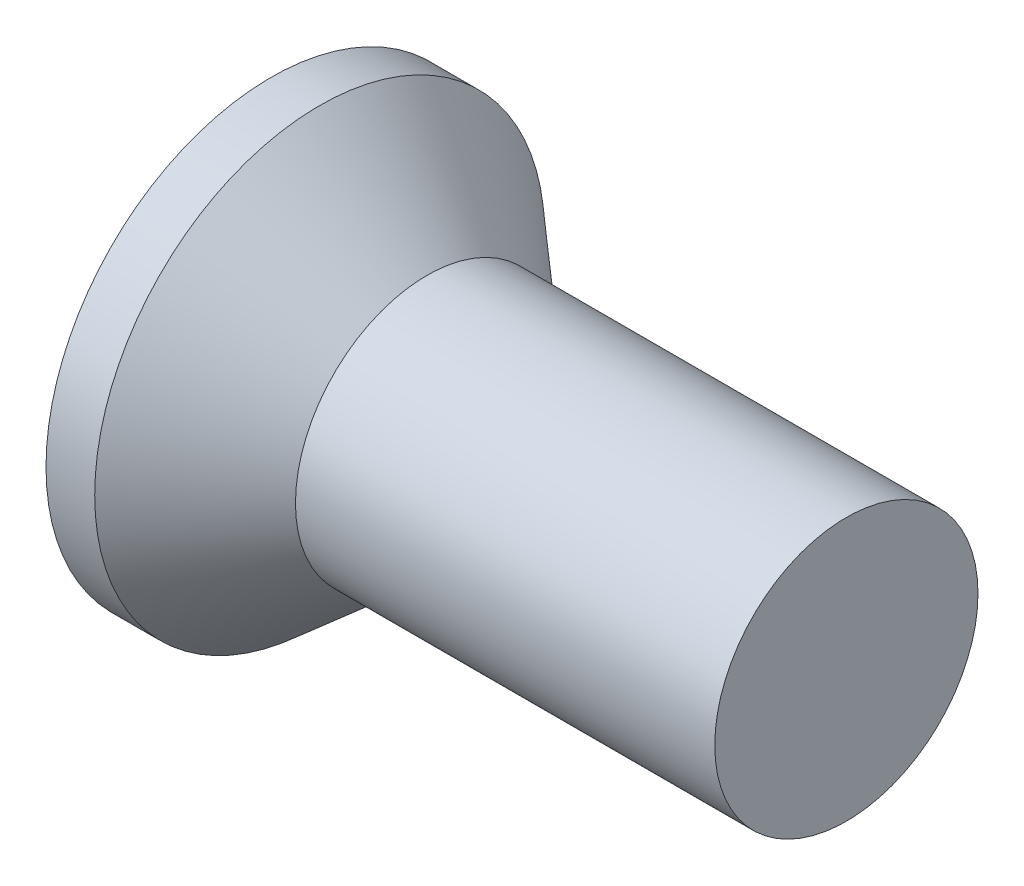
ISO-10303-21;
HEADER;
FILE_DESCRIPTION(('STEP AP214'),'2;1');
FILE_NAME('part.step','',(''),(''),'','','');
FILE_SCHEMA(('AUTOMOTIVE_DESIGN { 1 0 10303 214 1 1 1 1 }'));
ENDSEC;
DATA;
#1=APPLICATION_CONTEXT('core data for automotive mechanical design processes');
#2=APPLICATION_PROTOCOL_DEFINITION('international standard','automotive_design',2000,#1);
#3=PRODUCT_CONTEXT('',#1,'mechanical');
#4=PRODUCT('Part','Part','',(#3));
#5=PRODUCT_RELATED_PRODUCT_CATEGORY('part','',(#4));
#6=PRODUCT_DEFINITION_FORMATION('','',#4);
#7=PRODUCT_DEFINITION_CONTEXT('part definition',#1,'design');
#8=PRODUCT_DEFINITION('design','',#6,#7);
#9=PRODUCT_DEFINITION_SHAPE('','',#8);
#10=(LENGTH_UNIT() NAMED_UNIT(*) SI_UNIT(.MILLI.,.METRE.));
#11=(NAMED_UNIT(*) PLANE_ANGLE_UNIT() SI_UNIT($,.RADIAN.));
#12=(NAMED_UNIT(*) SI_UNIT($,.STERADIAN.) SOLID_ANGLE_UNIT());
#13=UNCERTAINTY_MEASURE_WITH_UNIT(LENGTH_MEASURE(1.E-05),#10,'distance_accuracy_value','');
#14=(GEOMETRIC_REPRESENTATION_CONTEXT(3) GLOBAL_UNCERTAINTY_ASSIGNED_CONTEXT((#13)) GLOBAL_UNIT_ASSIGNED_CONTEXT((#10,
#11,#12)) REPRESENTATION_CONTEXT('',''));
#15=CARTESIAN_POINT('',(0.,0.,0.));
#16=DIRECTION('',(0.,0.,1.));
#17=DIRECTION('',(1.,0.,0.));
#18=AXIS2_PLACEMENT_3D('',#15,#16,#17);
#19=CARTESIAN_POINT('',(0.,0.,0.));
#20=DIRECTION('',(-1.,0.,0.));
#21=DIRECTION('',(0.,0.,1.));
#22=AXIS2_PLACEMENT_3D('',#19,#20,#21);
#23=PLANE('',#22);
#24=CARTESIAN_POINT('',(0.,0.,0.));
#25=DIRECTION('',(-1.,0.,0.));
#26=DIRECTION('',(0.,0.,1.));
#27=AXIS2_PLACEMENT_3D('',#24,#25,#26);
#28=CIRCLE('',#27,1.8669);
#29=CARTESIAN_POINT('',(0.,0.,1.8669));
#30=VERTEX_POINT('',#29);
#31=EDGE_CURVE('E156',#30,#30,#28,.T.);
#32=ORIENTED_EDGE('',*,*,#31,.T.);
#33=EDGE_LOOP('',(#32));
#34=FACE_BOUND('',#33,.T.);
#35=DIRECTION('',(0.,1.,0.));
#36=VECTOR('',#35,1.);
#37=CARTESIAN_POINT('',(0.,-1.524,-0.342899999999999));
#38=LINE('',#37,#36);
#39=CARTESIAN_POINT('',(0.,-1.524,-0.342899999999999));
#40=VERTEX_POINT('',#39);
#41=CARTESIAN_POINT('',(0.,-0.342899999999999,-0.342899999999999));
#42=VERTEX_POINT('',#41);
#43=EDGE_CURVE('E140',#40,#42,#38,.T.);
#44=ORIENTED_EDGE('',*,*,#43,.T.);
#45=DIRECTION('',(0.,0.,-1.));
#46=VECTOR('',#45,1.);
#47=CARTESIAN_POINT('',(0.,-0.342900000000005,1.524));
#48=LINE('',#47,#46);
#49=CARTESIAN_POINT('',(0.,-0.342899999999995,-1.524));
#50=VERTEX_POINT('',#49);
#51=EDGE_CURVE('E108',#42,#50,#48,.T.);
#52=ORIENTED_EDGE('',*,*,#51,.T.);
#53=DIRECTION('',(0.,1.,0.));
#54=VECTOR('',#53,1.);
#55=CARTESIAN_POINT('',(0.,-0.342899999999995,-1.524));
#56=LINE('',#55,#54);
#57=CARTESIAN_POINT('',(0.,0.342900000000004,-1.524));
#58=VERTEX_POINT('',#57);
#59=EDGE_CURVE('E118',#50,#58,#56,.T.);
#60=ORIENTED_EDGE('',*,*,#59,.T.);
#61=DIRECTION('',(0.,0.,1.));
#62=VECTOR('',#61,1.);
#63=CARTESIAN_POINT('',(0.,0.342900000000004,-1.524));
#64=LINE('',#63,#62);
#65=CARTESIAN_POINT('',(0.,0.3429,-0.342899999999999));
#66=VERTEX_POINT('',#65);
#67=EDGE_CURVE('E352',#58,#66,#64,.T.);
#68=ORIENTED_EDGE('',*,*,#67,.T.);
#69=CARTESIAN_POINT('',(0.,1.524,-0.342899999999999));
#70=VERTEX_POINT('',#69);
#71=EDGE_CURVE('E143',#66,#70,#38,.T.);
#72=ORIENTED_EDGE('',*,*,#71,.T.);
#73=DIRECTION('',(0.,0.,1.));
#74=VECTOR('',#73,1.);
#75=CARTESIAN_POINT('',(0.,1.524,-0.342899999999999));
#76=LINE('',#75,#74);
#77=CARTESIAN_POINT('',(0.,1.524,0.3429));
#78=VERTEX_POINT('',#77);
#79=EDGE_CURVE('E147',#70,#78,#76,.T.);
#80=ORIENTED_EDGE('',*,*,#79,.T.);
#81=DIRECTION('',(0.,-1.,0.));
#82=VECTOR('',#81,1.);
#83=CARTESIAN_POINT('',(0.,1.524,0.3429));
#84=LINE('',#83,#82);
#85=CARTESIAN_POINT('',(0.,0.342899999999998,0.3429));
#86=VERTEX_POINT('',#85);
#87=EDGE_CURVE('E151',#78,#86,#84,.T.);
#88=ORIENTED_EDGE('',*,*,#87,.T.);
#89=CARTESIAN_POINT('',(0.,0.342899999999994,1.524));
#90=VERTEX_POINT('',#89);
#91=EDGE_CURVE('E119',#86,#90,#64,.T.);
#92=ORIENTED_EDGE('',*,*,#91,.T.);
#93=DIRECTION('',(0.,-1.,0.));
#94=VECTOR('',#93,1.);
#95=CARTESIAN_POINT('',(0.,0.342899999999994,1.524));
#96=LINE('',#95,#94);
#97=CARTESIAN_POINT('',(0.,-0.342900000000005,1.524));
#98=VERTEX_POINT('',#97);
#99=EDGE_CURVE('E355',#90,#98,#96,.T.);
#100=ORIENTED_EDGE('',*,*,#99,.T.);
#101=CARTESIAN_POINT('',(0.,-0.342900000000001,0.3429));
#102=VERTEX_POINT('',#101);
#103=EDGE_CURVE('E357',#98,#102,#48,.T.);
#104=ORIENTED_EDGE('',*,*,#103,.T.);
#105=CARTESIAN_POINT('',(0.,-1.524,0.3429));
#106=VERTEX_POINT('',#105);
#107=EDGE_CURVE('E150',#102,#106,#84,.T.);
#108=ORIENTED_EDGE('',*,*,#107,.T.);
#109=DIRECTION('',(0.,0.,-1.));
#110=VECTOR('',#109,1.);
#111=CARTESIAN_POINT('',(0.,-1.524,0.3429));
#112=LINE('',#111,#110);
#113=EDGE_CURVE('E154',#106,#40,#112,.T.);
#114=ORIENTED_EDGE('',*,*,#113,.T.);
#115=EDGE_LOOP('',(#44,#52,#60,#68,#72,#80,#88,#92,#100,#104,#108,#114));
#116=FACE_BOUND('',#115,.T.);
#117=ADVANCED_FACE('F36',(#34,#116),#23,.T.);
#118=CARTESIAN_POINT('',(1.8889014084507,0.,0.149716901408451));
#119=DIRECTION('',(-0.10174201540996,0.,-0.99481081734183));
#120=DIRECTION('',(-0.99481081734183,0.,0.10174201540996));
#121=AXIS2_PLACEMENT_3D('',#118,#119,#120);
#122=PLANE('',#121);
#123=ORIENTED_EDGE('',*,*,#107,.F.);
#124=DIRECTION('',(0.989701588102974,0.101219480601441,-0.10121948060144));
#125=VECTOR('',#124,1.);
#126=CARTESIAN_POINT('',(1.90389961056498,-0.148182994374036,0.148182994374036));
#127=LINE('',#126,#125);
#128=CARTESIAN_POINT('',(1.6764,-0.171450000000001,0.17145));
#129=VERTEX_POINT('',#128);
#130=EDGE_CURVE('E137',#102,#129,#127,.T.);
#131=ORIENTED_EDGE('',*,*,#130,.T.);
#132=DIRECTION('',(0.775819870407917,0.625945577260933,-0.0793452140189915));
#133=VECTOR('',#132,1.);
#134=CARTESIAN_POINT('',(0.,-1.524,0.3429));
#135=LINE('',#134,#133);
#136=EDGE_CURVE('E127',#106,#129,#135,.T.);
#137=ORIENTED_EDGE('',*,*,#136,.F.);
#138=EDGE_LOOP('',(#123,#131,#137));
#139=FACE_BOUND('',#138,.T.);
#140=ADVANCED_FACE('F181',(#139),#122,.T.);
#141=DIRECTION('',(0.775819870407917,-0.625945577260933,-0.0793452140189913));
#142=VECTOR('',#141,1.);
#143=CARTESIAN_POINT('',(0.,1.524,0.3429));
#144=LINE('',#143,#142);
#145=CARTESIAN_POINT('',(1.6764,0.17145,0.17145));
#146=VERTEX_POINT('',#145);
#147=EDGE_CURVE('E51',#78,#146,#144,.T.);
#148=ORIENTED_EDGE('',*,*,#147,.T.);
#149=DIRECTION('',(-0.989701588102974,0.10121948060144,0.10121948060144));
#150=VECTOR('',#149,1.);
#151=CARTESIAN_POINT('',(1.90389961056498,0.148182994374035,0.148182994374036));
#152=LINE('',#151,#150);
#153=EDGE_CURVE('E339',#146,#86,#152,.T.);
#154=ORIENTED_EDGE('',*,*,#153,.T.);
#155=ORIENTED_EDGE('',*,*,#87,.F.);
#156=EDGE_LOOP('',(#148,#154,#155));
#157=FACE_BOUND('',#156,.T.);
#158=ADVANCED_FACE('F187',(#157),#122,.T.);
#159=CARTESIAN_POINT('',(1.8889014084507,0.,-0.149716901408451));
#160=DIRECTION('',(-0.101742015409959,0.,0.99481081734183));
#161=DIRECTION('',(0.99481081734183,0.,0.101742015409959));
#162=AXIS2_PLACEMENT_3D('',#159,#160,#161);
#163=PLANE('',#162);
#164=DIRECTION('',(0.775819870407917,0.625945577260933,0.0793452140189911));
#165=VECTOR('',#164,1.);
#166=CARTESIAN_POINT('',(0.,-1.524,-0.342899999999999));
#167=LINE('',#166,#165);
#168=CARTESIAN_POINT('',(1.6764,-0.17145,-0.171450000000001));
#169=VERTEX_POINT('',#168);
#170=EDGE_CURVE('E59',#40,#169,#167,.T.);
#171=ORIENTED_EDGE('',*,*,#170,.T.);
#172=DIRECTION('',(-0.989701588102974,-0.10121948060144,-0.10121948060144));
#173=VECTOR('',#172,1.);
#174=CARTESIAN_POINT('',(1.90389961056498,-0.148182994374035,-0.148182994374036));
#175=LINE('',#174,#173);
#176=EDGE_CURVE('E11',#169,#42,#175,.T.);
#177=ORIENTED_EDGE('',*,*,#176,.T.);
#178=ORIENTED_EDGE('',*,*,#43,.F.);
#179=EDGE_LOOP('',(#171,#177,#178));
#180=FACE_BOUND('',#179,.T.);
#181=ADVANCED_FACE('F139',(#180),#163,.T.);
#182=ORIENTED_EDGE('',*,*,#71,.F.);
#183=DIRECTION('',(0.989701588102974,-0.10121948060144,0.10121948060144));
#184=VECTOR('',#183,1.);
#185=CARTESIAN_POINT('',(1.90389961056498,0.148182994374036,-0.148182994374036));
#186=LINE('',#185,#184);
#187=CARTESIAN_POINT('',(1.6764,0.17145,-0.17145));
#188=VERTEX_POINT('',#187);
#189=EDGE_CURVE('E350',#66,#188,#186,.T.);
#190=ORIENTED_EDGE('',*,*,#189,.T.);
#191=DIRECTION('',(0.775819870407917,-0.625945577260933,0.0793452140189911));
#192=VECTOR('',#191,1.);
#193=CARTESIAN_POINT('',(0.,1.524,-0.342899999999999));
#194=LINE('',#193,#192);
#195=EDGE_CURVE('E130',#70,#188,#194,.T.);
#196=ORIENTED_EDGE('',*,*,#195,.F.);
#197=EDGE_LOOP('',(#182,#190,#196));
#198=FACE_BOUND('',#197,.T.);
#199=ADVANCED_FACE('F172',(#198),#163,.T.);
#200=CARTESIAN_POINT('',(4.7752,1.0922,0.));
#201=DIRECTION('',(1.,0.,0.));
#202=DIRECTION('',(0.,0.,-1.));
#203=AXIS2_PLACEMENT_3D('',#200,#201,#202);
#204=PLANE('',#203);
#205=CARTESIAN_POINT('',(4.7752,0.,0.));
#206=DIRECTION('',(-1.,0.,0.));
#207=DIRECTION('',(0.,0.,1.));
#208=AXIS2_PLACEMENT_3D('',#205,#206,#207);
#209=CIRCLE('',#208,1.0922);
#210=CARTESIAN_POINT('',(4.7752,0.,1.0922));
#211=VERTEX_POINT('',#210);
#212=EDGE_CURVE('E44',#211,#211,#209,.T.);
#213=ORIENTED_EDGE('',*,*,#212,.F.);
#214=EDGE_LOOP('',(#213));
#215=FACE_BOUND('',#214,.T.);
#216=ADVANCED_FACE('F38',(#215),#204,.T.);
#217=CARTESIAN_POINT('',(-6.34999999999999,0.,0.));
#218=DIRECTION('',(-1.,0.,0.));
#219=DIRECTION('',(0.,0.,1.));
#220=AXIS2_PLACEMENT_3D('',#217,#218,#219);
#221=CYLINDRICAL_SURFACE('',#220,1.0922);
#222=ORIENTED_EDGE('',*,*,#212,.T.);
#223=EDGE_LOOP('',(#222));
#224=FACE_BOUND('',#223,.T.);
#225=CARTESIAN_POINT('',(1.2954,0.,0.));
#226=DIRECTION('',(-1.,0.,0.));
#227=DIRECTION('',(0.,0.,1.));
#228=AXIS2_PLACEMENT_3D('',#225,#226,#227);
#229=CIRCLE('',#228,1.0922);
#230=CARTESIAN_POINT('',(1.2954,0.,1.0922));
#231=VERTEX_POINT('',#230);
#232=EDGE_CURVE('E163',#231,#231,#229,.T.);
#233=ORIENTED_EDGE('',*,*,#232,.F.);
#234=EDGE_LOOP('',(#233));
#235=FACE_BOUND('',#234,.T.);
#236=ADVANCED_FACE('F168',(#224,#235),#221,.T.);
#237=CARTESIAN_POINT('',(0.404209594925888,0.,0.));
#238=DIRECTION('',(-1.,0.,0.));
#239=DIRECTION('',(0.,0.,1.));
#240=AXIS2_PLACEMENT_3D('',#237,#238,#239);
#241=CONICAL_SURFACE('',#240,1.8669,0.715584993317677);
#242=ORIENTED_EDGE('',*,*,#232,.T.);
#243=EDGE_LOOP('',(#242));
#244=FACE_BOUND('',#243,.T.);
#245=CARTESIAN_POINT('',(0.404209594925888,0.,0.));
#246=DIRECTION('',(-1.,0.,0.));
#247=DIRECTION('',(0.,0.,1.));
#248=AXIS2_PLACEMENT_3D('',#245,#246,#247);
#249=CIRCLE('',#248,1.8669);
#250=CARTESIAN_POINT('',(0.404209594925888,0.,1.8669));
#251=VERTEX_POINT('',#250);
#252=EDGE_CURVE('E160',#251,#251,#249,.T.);
#253=ORIENTED_EDGE('',*,*,#252,.F.);
#254=EDGE_LOOP('',(#253));
#255=FACE_BOUND('',#254,.T.);
#256=ADVANCED_FACE('F177',(#244,#255),#241,.T.);
#257=CARTESIAN_POINT('',(-6.34999999999999,0.,0.));
#258=DIRECTION('',(-1.,0.,0.));
#259=DIRECTION('',(0.,0.,1.));
#260=AXIS2_PLACEMENT_3D('',#257,#258,#259);
#261=CYLINDRICAL_SURFACE('',#260,1.8669);
#262=ORIENTED_EDGE('',*,*,#252,.T.);
#263=EDGE_LOOP('',(#262));
#264=FACE_BOUND('',#263,.T.);
#265=ORIENTED_EDGE('',*,*,#31,.F.);
#266=EDGE_LOOP('',(#265));
#267=FACE_BOUND('',#266,.T.);
#268=ADVANCED_FACE('F193',(#264,#267),#261,.T.);
#269=CARTESIAN_POINT('',(1.6764,0.17145,-0.17145));
#270=DIRECTION('',(1.,0.,0.));
#271=DIRECTION('',(0.,0.,-1.));
#272=AXIS2_PLACEMENT_3D('',#269,#270,#271);
#273=PLANE('',#272);
#274=DIRECTION('',(0.,1.,0.));
#275=VECTOR('',#274,1.);
#276=CARTESIAN_POINT('',(1.6764,-0.17145,-0.17145));
#277=LINE('',#276,#275);
#278=EDGE_CURVE('E115',#169,#188,#277,.T.);
#279=ORIENTED_EDGE('',*,*,#278,.F.);
#280=DIRECTION('',(0.,0.,-1.));
#281=VECTOR('',#280,1.);
#282=CARTESIAN_POINT('',(1.6764,-0.17145,0.17145));
#283=LINE('',#282,#281);
#284=EDGE_CURVE('E124',#129,#169,#283,.T.);
#285=ORIENTED_EDGE('',*,*,#284,.F.);
#286=DIRECTION('',(0.,-1.,0.));
#287=VECTOR('',#286,1.);
#288=CARTESIAN_POINT('',(1.6764,0.17145,0.17145));
#289=LINE('',#288,#287);
#290=EDGE_CURVE('E131',#146,#129,#289,.T.);
#291=ORIENTED_EDGE('',*,*,#290,.F.);
#292=DIRECTION('',(0.,0.,1.));
#293=VECTOR('',#292,1.);
#294=CARTESIAN_POINT('',(1.6764,0.17145,-0.17145));
#295=LINE('',#294,#293);
#296=EDGE_CURVE('E135',#188,#146,#295,.T.);
#297=ORIENTED_EDGE('',*,*,#296,.F.);
#298=EDGE_LOOP('',(#279,#285,#291,#297));
#299=FACE_BOUND('',#298,.T.);
#300=ADVANCED_FACE('F134',(#299),#273,.F.);
#301=CARTESIAN_POINT('',(0.,-1.524,-0.342899999999999));
#302=DIRECTION('',(-0.627925301137923,0.778273612677989,0.));
#303=DIRECTION('',(-0.778273612677989,-0.627925301137923,0.));
#304=AXIS2_PLACEMENT_3D('',#301,#302,#303);
#305=PLANE('',#304);
#306=ORIENTED_EDGE('',*,*,#170,.F.);
#307=ORIENTED_EDGE('',*,*,#113,.F.);
#308=ORIENTED_EDGE('',*,*,#136,.T.);
#309=ORIENTED_EDGE('',*,*,#284,.T.);
#310=EDGE_LOOP('',(#306,#307,#308,#309));
#311=FACE_BOUND('',#310,.T.);
#312=ADVANCED_FACE('F125',(#311),#305,.T.);
#313=CARTESIAN_POINT('',(1.6764,0.17145,0.17145));
#314=DIRECTION('',(-0.627925301137923,-0.778273612677989,0.));
#315=DIRECTION('',(0.778273612677989,-0.627925301137923,0.));
#316=AXIS2_PLACEMENT_3D('',#313,#314,#315);
#317=PLANE('',#316);
#318=ORIENTED_EDGE('',*,*,#147,.F.);
#319=ORIENTED_EDGE('',*,*,#79,.F.);
#320=ORIENTED_EDGE('',*,*,#195,.T.);
#321=ORIENTED_EDGE('',*,*,#296,.T.);
#322=EDGE_LOOP('',(#318,#319,#320,#321));
#323=FACE_BOUND('',#322,.T.);
#324=ADVANCED_FACE('F220',(#323),#317,.T.);
#325=CARTESIAN_POINT('',(1.8889014084507,-0.149716901408451,0.));
#326=DIRECTION('',(-0.10174201540996,0.99481081734183,0.));
#327=DIRECTION('',(-0.99481081734183,-0.10174201540996,0.));
#328=AXIS2_PLACEMENT_3D('',#325,#326,#327);
#329=PLANE('',#328);
#330=DIRECTION('',(0.775819870407917,0.0793452140189893,0.625945577260934));
#331=VECTOR('',#330,1.);
#332=CARTESIAN_POINT('',(0.,-0.342899999999995,-1.524));
#333=LINE('',#332,#331);
#334=EDGE_CURVE('E106',#50,#169,#333,.T.);
#335=ORIENTED_EDGE('',*,*,#334,.F.);
#336=ORIENTED_EDGE('',*,*,#51,.F.);
#337=ORIENTED_EDGE('',*,*,#176,.F.);
#338=EDGE_LOOP('',(#335,#336,#337));
#339=FACE_BOUND('',#338,.T.);
#340=ADVANCED_FACE('F105',(#339),#329,.T.);
#341=CARTESIAN_POINT('',(1.8889014084507,0.149716901408451,0.));
#342=DIRECTION('',(-0.101742015409959,-0.99481081734183,0.));
#343=DIRECTION('',(0.99481081734183,-0.101742015409959,0.));
#344=AXIS2_PLACEMENT_3D('',#341,#342,#343);
#345=PLANE('',#344);
#346=ORIENTED_EDGE('',*,*,#67,.F.);
#347=DIRECTION('',(0.775819870407917,-0.0793452140189933,0.625945577260933));
#348=VECTOR('',#347,1.);
#349=CARTESIAN_POINT('',(0.,0.342900000000004,-1.524));
#350=LINE('',#349,#348);
#351=EDGE_CURVE('E120',#58,#188,#350,.T.);
#352=ORIENTED_EDGE('',*,*,#351,.T.);
#353=ORIENTED_EDGE('',*,*,#189,.F.);
#354=EDGE_LOOP('',(#346,#352,#353));
#355=FACE_BOUND('',#354,.T.);
#356=ADVANCED_FACE('F238',(#355),#345,.T.);
#357=CARTESIAN_POINT('',(0.,0.342900000000004,-1.524));
#358=DIRECTION('',(-0.627925301137923,0.,0.778273612677989));
#359=DIRECTION('',(-0.778273612677989,0.,-0.627925301137923));
#360=AXIS2_PLACEMENT_3D('',#357,#358,#359);
#361=PLANE('',#360);
#362=ORIENTED_EDGE('',*,*,#351,.F.);
#363=ORIENTED_EDGE('',*,*,#59,.F.);
#364=ORIENTED_EDGE('',*,*,#334,.T.);
#365=ORIENTED_EDGE('',*,*,#278,.T.);
#366=EDGE_LOOP('',(#362,#363,#364,#365));
#367=FACE_BOUND('',#366,.T.);
#368=ADVANCED_FACE('F113',(#367),#361,.T.);
#369=ORIENTED_EDGE('',*,*,#103,.F.);
#370=DIRECTION('',(0.775819870407917,0.0793452140189935,-0.625945577260933));
#371=VECTOR('',#370,1.);
#372=CARTESIAN_POINT('',(0.,-0.342900000000005,1.524));
#373=LINE('',#372,#371);
#374=EDGE_CURVE('E362',#98,#129,#373,.T.);
#375=ORIENTED_EDGE('',*,*,#374,.T.);
#376=ORIENTED_EDGE('',*,*,#130,.F.);
#377=EDGE_LOOP('',(#369,#375,#376));
#378=FACE_BOUND('',#377,.T.);
#379=ADVANCED_FACE('F240',(#378),#329,.T.);
#380=DIRECTION('',(0.775819870407917,-0.079345214018989,-0.625945577260933));
#381=VECTOR('',#380,1.);
#382=CARTESIAN_POINT('',(0.,0.342899999999994,1.524));
#383=LINE('',#382,#381);
#384=EDGE_CURVE('E365',#90,#146,#383,.T.);
#385=ORIENTED_EDGE('',*,*,#384,.F.);
#386=ORIENTED_EDGE('',*,*,#91,.F.);
#387=ORIENTED_EDGE('',*,*,#153,.F.);
#388=EDGE_LOOP('',(#385,#386,#387));
#389=FACE_BOUND('',#388,.T.);
#390=ADVANCED_FACE('F248',(#389),#345,.T.);
#391=CARTESIAN_POINT('',(1.6764,-0.171450000000001,0.171449999999999));
#392=DIRECTION('',(-0.627925301137923,0.,-0.778273612677989));
#393=DIRECTION('',(0.778273612677989,0.,-0.627925301137923));
#394=AXIS2_PLACEMENT_3D('',#391,#392,#393);
#395=PLANE('',#394);
#396=ORIENTED_EDGE('',*,*,#374,.F.);
#397=ORIENTED_EDGE('',*,*,#99,.F.);
#398=ORIENTED_EDGE('',*,*,#384,.T.);
#399=ORIENTED_EDGE('',*,*,#290,.T.);
#400=EDGE_LOOP('',(#396,#397,#398,#399));
#401=FACE_BOUND('',#400,.T.);
#402=ADVANCED_FACE('F266',(#401),#395,.T.);
#403=CLOSED_SHELL('',(#117,#140,#158,#181,#199,#216,#236,#256,#268,#300,#312,#324,#340,#356,
#368,#379,#390,#402));
#404=MANIFOLD_SOLID_BREP('B2',#403);
#405=ADVANCED_BREP_SHAPE_REPRESENTATION('',(#18,#404),#14);
#406=SHAPE_DEFINITION_REPRESENTATION(#9,#405);
ENDSEC;
END-ISO-10303-21;
